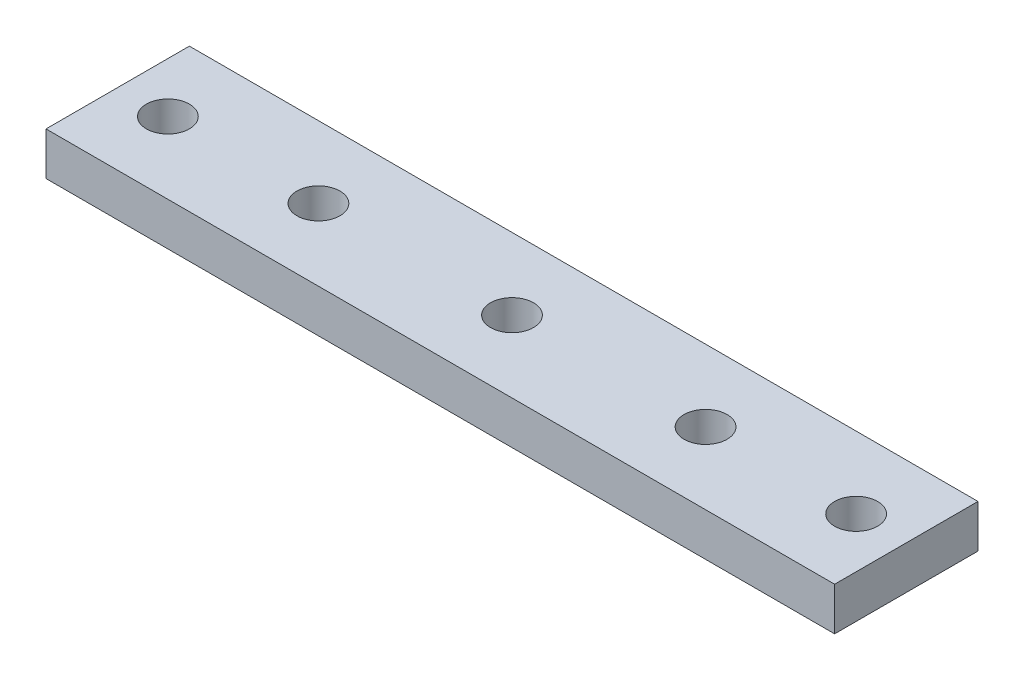
ISO-10303-21;
HEADER;
FILE_DESCRIPTION(('STEP AP214'),'2;1');
FILE_NAME('part.step','',(''),(''),'','','');
FILE_SCHEMA(('AUTOMOTIVE_DESIGN { 1 0 10303 214 1 1 1 1 }'));
ENDSEC;
DATA;
#1=APPLICATION_CONTEXT('core data for automotive mechanical design processes');
#2=APPLICATION_PROTOCOL_DEFINITION('international standard','automotive_design',2000,#1);
#3=PRODUCT_CONTEXT('',#1,'mechanical');
#4=PRODUCT('Part','Part','',(#3));
#5=PRODUCT_RELATED_PRODUCT_CATEGORY('part','',(#4));
#6=PRODUCT_DEFINITION_FORMATION('','',#4);
#7=PRODUCT_DEFINITION_CONTEXT('part definition',#1,'design');
#8=PRODUCT_DEFINITION('design','',#6,#7);
#9=PRODUCT_DEFINITION_SHAPE('','',#8);
#10=(LENGTH_UNIT() NAMED_UNIT(*) SI_UNIT(.MILLI.,.METRE.));
#11=(NAMED_UNIT(*) PLANE_ANGLE_UNIT() SI_UNIT($,.RADIAN.));
#12=(NAMED_UNIT(*) SI_UNIT($,.STERADIAN.) SOLID_ANGLE_UNIT());
#13=UNCERTAINTY_MEASURE_WITH_UNIT(LENGTH_MEASURE(1.E-05),#10,'distance_accuracy_value','');
#14=(GEOMETRIC_REPRESENTATION_CONTEXT(3) GLOBAL_UNCERTAINTY_ASSIGNED_CONTEXT((#13)) GLOBAL_UNIT_ASSIGNED_CONTEXT((#10,
#11,#12)) REPRESENTATION_CONTEXT('',''));
#15=CARTESIAN_POINT('',(0.,0.,0.));
#16=DIRECTION('',(0.,0.,1.));
#17=DIRECTION('',(1.,0.,0.));
#18=AXIS2_PLACEMENT_3D('',#15,#16,#17);
#19=CARTESIAN_POINT('',(0.,6.,0.));
#20=DIRECTION('',(0.,-1.,0.));
#21=DIRECTION('',(0.,0.,-1.));
#22=AXIS2_PLACEMENT_3D('',#19,#20,#21);
#23=PLANE('',#22);
#24=DIRECTION('',(1.,0.,0.));
#25=VECTOR('',#24,1.);
#26=CARTESIAN_POINT('',(110.,6.,0.));
#27=LINE('',#26,#25);
#28=CARTESIAN_POINT('',(0.,6.,0.));
#29=VERTEX_POINT('',#28);
#30=CARTESIAN_POINT('',(110.,6.,0.));
#31=VERTEX_POINT('',#30);
#32=EDGE_CURVE('E85',#29,#31,#27,.T.);
#33=ORIENTED_EDGE('',*,*,#32,.T.);
#34=DIRECTION('',(0.,0.,-1.));
#35=VECTOR('',#34,1.);
#36=CARTESIAN_POINT('',(110.,6.,-20.));
#37=LINE('',#36,#35);
#38=CARTESIAN_POINT('',(110.,6.,-20.));
#39=VERTEX_POINT('',#38);
#40=EDGE_CURVE('E80',#31,#39,#37,.T.);
#41=ORIENTED_EDGE('',*,*,#40,.T.);
#42=DIRECTION('',(-1.,0.,0.));
#43=VECTOR('',#42,1.);
#44=CARTESIAN_POINT('',(0.,6.,-20.));
#45=LINE('',#44,#43);
#46=CARTESIAN_POINT('',(0.,6.,-20.));
#47=VERTEX_POINT('',#46);
#48=EDGE_CURVE('E83',#39,#47,#45,.T.);
#49=ORIENTED_EDGE('',*,*,#48,.T.);
#50=DIRECTION('',(0.,0.,1.));
#51=VECTOR('',#50,1.);
#52=CARTESIAN_POINT('',(0.,6.,0.));
#53=LINE('',#52,#51);
#54=EDGE_CURVE('E50',#47,#29,#53,.T.);
#55=ORIENTED_EDGE('',*,*,#54,.T.);
#56=EDGE_LOOP('',(#33,#41,#49,#55));
#57=FACE_BOUND('',#56,.T.);
#58=CARTESIAN_POINT('',(28.,6.,-10.));
#59=DIRECTION('',(0.,1.,0.));
#60=DIRECTION('',(0.,0.,1.));
#61=AXIS2_PLACEMENT_3D('',#58,#59,#60);
#62=CIRCLE('',#61,2.99999999999999);
#63=CARTESIAN_POINT('',(28.,6.,-7.00000000000001));
#64=VERTEX_POINT('',#63);
#65=EDGE_CURVE('E100',#64,#64,#62,.T.);
#66=ORIENTED_EDGE('',*,*,#65,.F.);
#67=EDGE_LOOP('',(#66));
#68=FACE_BOUND('',#67,.T.);
#69=CARTESIAN_POINT('',(82.,6.,-10.));
#70=DIRECTION('',(0.,1.,0.));
#71=DIRECTION('',(0.,0.,1.));
#72=AXIS2_PLACEMENT_3D('',#69,#70,#71);
#73=CIRCLE('',#72,3.00000000000001);
#74=CARTESIAN_POINT('',(82.,6.,-7.));
#75=VERTEX_POINT('',#74);
#76=EDGE_CURVE('E115',#75,#75,#73,.T.);
#77=ORIENTED_EDGE('',*,*,#76,.F.);
#78=EDGE_LOOP('',(#77));
#79=FACE_BOUND('',#78,.T.);
#80=CARTESIAN_POINT('',(103.,6.,-10.));
#81=DIRECTION('',(0.,1.,0.));
#82=DIRECTION('',(0.,0.,1.));
#83=AXIS2_PLACEMENT_3D('',#80,#81,#82);
#84=CIRCLE('',#83,3.00000000000001);
#85=CARTESIAN_POINT('',(103.,6.,-6.99999999999999));
#86=VERTEX_POINT('',#85);
#87=EDGE_CURVE('E121',#86,#86,#84,.T.);
#88=ORIENTED_EDGE('',*,*,#87,.F.);
#89=EDGE_LOOP('',(#88));
#90=FACE_BOUND('',#89,.T.);
#91=CARTESIAN_POINT('',(7.,6.,-10.));
#92=DIRECTION('',(0.,1.,0.));
#93=DIRECTION('',(0.,0.,1.));
#94=AXIS2_PLACEMENT_3D('',#91,#92,#93);
#95=CIRCLE('',#94,3.);
#96=CARTESIAN_POINT('',(7.,6.,-7.));
#97=VERTEX_POINT('',#96);
#98=EDGE_CURVE('E127',#97,#97,#95,.T.);
#99=ORIENTED_EDGE('',*,*,#98,.F.);
#100=EDGE_LOOP('',(#99));
#101=FACE_BOUND('',#100,.T.);
#102=CARTESIAN_POINT('',(55.,6.,-10.));
#103=DIRECTION('',(0.,1.,0.));
#104=DIRECTION('',(0.,0.,1.));
#105=AXIS2_PLACEMENT_3D('',#102,#103,#104);
#106=CIRCLE('',#105,3.00000000000001);
#107=CARTESIAN_POINT('',(55.,6.,-6.99999999999999));
#108=VERTEX_POINT('',#107);
#109=EDGE_CURVE('E133',#108,#108,#106,.T.);
#110=ORIENTED_EDGE('',*,*,#109,.F.);
#111=EDGE_LOOP('',(#110));
#112=FACE_BOUND('',#111,.T.);
#113=ADVANCED_FACE('F33',(#57,#68,#79,#90,#101,#112),#23,.F.);
#114=CARTESIAN_POINT('',(0.,0.,0.));
#115=DIRECTION('',(0.,-1.,0.));
#116=DIRECTION('',(0.,0.,-1.));
#117=AXIS2_PLACEMENT_3D('',#114,#115,#116);
#118=PLANE('',#117);
#119=CARTESIAN_POINT('',(7.,0.,-10.));
#120=DIRECTION('',(0.,1.,0.));
#121=DIRECTION('',(0.,0.,1.));
#122=AXIS2_PLACEMENT_3D('',#119,#120,#121);
#123=CIRCLE('',#122,3.);
#124=CARTESIAN_POINT('',(7.,0.,-7.));
#125=VERTEX_POINT('',#124);
#126=EDGE_CURVE('E130',#125,#125,#123,.T.);
#127=ORIENTED_EDGE('',*,*,#126,.T.);
#128=EDGE_LOOP('',(#127));
#129=FACE_BOUND('',#128,.T.);
#130=CARTESIAN_POINT('',(82.,0.,-10.));
#131=DIRECTION('',(0.,1.,0.));
#132=DIRECTION('',(0.,0.,1.));
#133=AXIS2_PLACEMENT_3D('',#130,#131,#132);
#134=CIRCLE('',#133,3.00000000000001);
#135=CARTESIAN_POINT('',(82.,0.,-7.));
#136=VERTEX_POINT('',#135);
#137=EDGE_CURVE('E118',#136,#136,#134,.T.);
#138=ORIENTED_EDGE('',*,*,#137,.T.);
#139=EDGE_LOOP('',(#138));
#140=FACE_BOUND('',#139,.T.);
#141=DIRECTION('',(1.,0.,0.));
#142=VECTOR('',#141,1.);
#143=CARTESIAN_POINT('',(110.,0.,0.));
#144=LINE('',#143,#142);
#145=CARTESIAN_POINT('',(0.,0.,0.));
#146=VERTEX_POINT('',#145);
#147=CARTESIAN_POINT('',(110.,0.,0.));
#148=VERTEX_POINT('',#147);
#149=EDGE_CURVE('E97',#146,#148,#144,.T.);
#150=ORIENTED_EDGE('',*,*,#149,.F.);
#151=DIRECTION('',(0.,0.,1.));
#152=VECTOR('',#151,1.);
#153=CARTESIAN_POINT('',(0.,0.,0.));
#154=LINE('',#153,#152);
#155=CARTESIAN_POINT('',(0.,0.,-20.));
#156=VERTEX_POINT('',#155);
#157=EDGE_CURVE('E73',#156,#146,#154,.T.);
#158=ORIENTED_EDGE('',*,*,#157,.F.);
#159=DIRECTION('',(-1.,0.,0.));
#160=VECTOR('',#159,1.);
#161=CARTESIAN_POINT('',(0.,0.,-20.));
#162=LINE('',#161,#160);
#163=CARTESIAN_POINT('',(110.,0.,-20.));
#164=VERTEX_POINT('',#163);
#165=EDGE_CURVE('E67',#164,#156,#162,.T.);
#166=ORIENTED_EDGE('',*,*,#165,.F.);
#167=DIRECTION('',(0.,0.,-1.));
#168=VECTOR('',#167,1.);
#169=CARTESIAN_POINT('',(110.,0.,-20.));
#170=LINE('',#169,#168);
#171=EDGE_CURVE('E89',#148,#164,#170,.T.);
#172=ORIENTED_EDGE('',*,*,#171,.F.);
#173=EDGE_LOOP('',(#150,#158,#166,#172));
#174=FACE_BOUND('',#173,.T.);
#175=CARTESIAN_POINT('',(28.,0.,-10.));
#176=DIRECTION('',(0.,1.,0.));
#177=DIRECTION('',(0.,0.,1.));
#178=AXIS2_PLACEMENT_3D('',#175,#176,#177);
#179=CIRCLE('',#178,2.99999999999999);
#180=CARTESIAN_POINT('',(28.,0.,-7.00000000000001));
#181=VERTEX_POINT('',#180);
#182=EDGE_CURVE('E112',#181,#181,#179,.T.);
#183=ORIENTED_EDGE('',*,*,#182,.T.);
#184=EDGE_LOOP('',(#183));
#185=FACE_BOUND('',#184,.T.);
#186=CARTESIAN_POINT('',(103.,0.,-10.));
#187=DIRECTION('',(0.,1.,0.));
#188=DIRECTION('',(0.,0.,1.));
#189=AXIS2_PLACEMENT_3D('',#186,#187,#188);
#190=CIRCLE('',#189,3.00000000000001);
#191=CARTESIAN_POINT('',(103.,0.,-6.99999999999999));
#192=VERTEX_POINT('',#191);
#193=EDGE_CURVE('E124',#192,#192,#190,.T.);
#194=ORIENTED_EDGE('',*,*,#193,.T.);
#195=EDGE_LOOP('',(#194));
#196=FACE_BOUND('',#195,.T.);
#197=CARTESIAN_POINT('',(55.,0.,-10.));
#198=DIRECTION('',(0.,1.,0.));
#199=DIRECTION('',(0.,0.,1.));
#200=AXIS2_PLACEMENT_3D('',#197,#198,#199);
#201=CIRCLE('',#200,3.00000000000001);
#202=CARTESIAN_POINT('',(55.,0.,-6.99999999999999));
#203=VERTEX_POINT('',#202);
#204=EDGE_CURVE('E136',#203,#203,#201,.T.);
#205=ORIENTED_EDGE('',*,*,#204,.T.);
#206=EDGE_LOOP('',(#205));
#207=FACE_BOUND('',#206,.T.);
#208=ADVANCED_FACE('F108',(#129,#140,#174,#185,#196,#207),#118,.T.);
#209=CARTESIAN_POINT('',(110.,6.,0.));
#210=DIRECTION('',(0.,0.,-1.));
#211=DIRECTION('',(-1.,0.,0.));
#212=AXIS2_PLACEMENT_3D('',#209,#210,#211);
#213=PLANE('',#212);
#214=ORIENTED_EDGE('',*,*,#149,.T.);
#215=DIRECTION('',(0.,-1.,0.));
#216=VECTOR('',#215,1.);
#217=CARTESIAN_POINT('',(110.,6.,0.));
#218=LINE('',#217,#216);
#219=EDGE_CURVE('E11',#31,#148,#218,.T.);
#220=ORIENTED_EDGE('',*,*,#219,.F.);
#221=ORIENTED_EDGE('',*,*,#32,.F.);
#222=DIRECTION('',(0.,-1.,0.));
#223=VECTOR('',#222,1.);
#224=CARTESIAN_POINT('',(0.,6.,0.));
#225=LINE('',#224,#223);
#226=EDGE_CURVE('E93',#29,#146,#225,.T.);
#227=ORIENTED_EDGE('',*,*,#226,.T.);
#228=EDGE_LOOP('',(#214,#220,#221,#227));
#229=FACE_BOUND('',#228,.T.);
#230=ADVANCED_FACE('F35',(#229),#213,.F.);
#231=CARTESIAN_POINT('',(110.,6.,-20.));
#232=DIRECTION('',(-1.,0.,0.));
#233=DIRECTION('',(0.,0.,1.));
#234=AXIS2_PLACEMENT_3D('',#231,#232,#233);
#235=PLANE('',#234);
#236=ORIENTED_EDGE('',*,*,#171,.T.);
#237=DIRECTION('',(0.,-1.,0.));
#238=VECTOR('',#237,1.);
#239=CARTESIAN_POINT('',(110.,6.,-20.));
#240=LINE('',#239,#238);
#241=EDGE_CURVE('E42',#39,#164,#240,.T.);
#242=ORIENTED_EDGE('',*,*,#241,.F.);
#243=ORIENTED_EDGE('',*,*,#40,.F.);
#244=ORIENTED_EDGE('',*,*,#219,.T.);
#245=EDGE_LOOP('',(#236,#242,#243,#244));
#246=FACE_BOUND('',#245,.T.);
#247=ADVANCED_FACE('F88',(#246),#235,.F.);
#248=CARTESIAN_POINT('',(0.,6.,-20.));
#249=DIRECTION('',(0.,0.,1.));
#250=DIRECTION('',(1.,0.,0.));
#251=AXIS2_PLACEMENT_3D('',#248,#249,#250);
#252=PLANE('',#251);
#253=ORIENTED_EDGE('',*,*,#165,.T.);
#254=DIRECTION('',(0.,-1.,0.));
#255=VECTOR('',#254,1.);
#256=CARTESIAN_POINT('',(0.,6.,-20.));
#257=LINE('',#256,#255);
#258=EDGE_CURVE('E90',#47,#156,#257,.T.);
#259=ORIENTED_EDGE('',*,*,#258,.F.);
#260=ORIENTED_EDGE('',*,*,#48,.F.);
#261=ORIENTED_EDGE('',*,*,#241,.T.);
#262=EDGE_LOOP('',(#253,#259,#260,#261));
#263=FACE_BOUND('',#262,.T.);
#264=ADVANCED_FACE('F91',(#263),#252,.F.);
#265=CARTESIAN_POINT('',(0.,6.,0.));
#266=DIRECTION('',(1.,0.,0.));
#267=DIRECTION('',(0.,0.,-1.));
#268=AXIS2_PLACEMENT_3D('',#265,#266,#267);
#269=PLANE('',#268);
#270=ORIENTED_EDGE('',*,*,#157,.T.);
#271=ORIENTED_EDGE('',*,*,#226,.F.);
#272=ORIENTED_EDGE('',*,*,#54,.F.);
#273=ORIENTED_EDGE('',*,*,#258,.T.);
#274=EDGE_LOOP('',(#270,#271,#272,#273));
#275=FACE_BOUND('',#274,.T.);
#276=ADVANCED_FACE('F105',(#275),#269,.F.);
#277=CARTESIAN_POINT('',(28.,6.,-10.));
#278=DIRECTION('',(0.,-1.,0.));
#279=DIRECTION('',(0.,0.,-1.));
#280=AXIS2_PLACEMENT_3D('',#277,#278,#279);
#281=CYLINDRICAL_SURFACE('',#280,2.99999999999999);
#282=ORIENTED_EDGE('',*,*,#65,.T.);
#283=EDGE_LOOP('',(#282));
#284=FACE_BOUND('',#283,.T.);
#285=ORIENTED_EDGE('',*,*,#182,.F.);
#286=EDGE_LOOP('',(#285));
#287=FACE_BOUND('',#286,.T.);
#288=ADVANCED_FACE('F153',(#284,#287),#281,.F.);
#289=CARTESIAN_POINT('',(82.,6.,-10.));
#290=DIRECTION('',(0.,-1.,0.));
#291=DIRECTION('',(0.,0.,-1.));
#292=AXIS2_PLACEMENT_3D('',#289,#290,#291);
#293=CYLINDRICAL_SURFACE('',#292,3.00000000000001);
#294=ORIENTED_EDGE('',*,*,#76,.T.);
#295=EDGE_LOOP('',(#294));
#296=FACE_BOUND('',#295,.T.);
#297=ORIENTED_EDGE('',*,*,#137,.F.);
#298=EDGE_LOOP('',(#297));
#299=FACE_BOUND('',#298,.T.);
#300=ADVANCED_FACE('F199',(#296,#299),#293,.F.);
#301=CARTESIAN_POINT('',(103.,6.,-10.));
#302=DIRECTION('',(0.,-1.,0.));
#303=DIRECTION('',(0.,0.,-1.));
#304=AXIS2_PLACEMENT_3D('',#301,#302,#303);
#305=CYLINDRICAL_SURFACE('',#304,3.00000000000001);
#306=ORIENTED_EDGE('',*,*,#87,.T.);
#307=EDGE_LOOP('',(#306));
#308=FACE_BOUND('',#307,.T.);
#309=ORIENTED_EDGE('',*,*,#193,.F.);
#310=EDGE_LOOP('',(#309));
#311=FACE_BOUND('',#310,.T.);
#312=ADVANCED_FACE('F207',(#308,#311),#305,.F.);
#313=CARTESIAN_POINT('',(7.,6.,-10.));
#314=DIRECTION('',(0.,-1.,0.));
#315=DIRECTION('',(0.,0.,-1.));
#316=AXIS2_PLACEMENT_3D('',#313,#314,#315);
#317=CYLINDRICAL_SURFACE('',#316,3.);
#318=ORIENTED_EDGE('',*,*,#98,.T.);
#319=EDGE_LOOP('',(#318));
#320=FACE_BOUND('',#319,.T.);
#321=ORIENTED_EDGE('',*,*,#126,.F.);
#322=EDGE_LOOP('',(#321));
#323=FACE_BOUND('',#322,.T.);
#324=ADVANCED_FACE('F215',(#320,#323),#317,.F.);
#325=CARTESIAN_POINT('',(55.,6.,-10.));
#326=DIRECTION('',(0.,-1.,0.));
#327=DIRECTION('',(0.,0.,-1.));
#328=AXIS2_PLACEMENT_3D('',#325,#326,#327);
#329=CYLINDRICAL_SURFACE('',#328,3.00000000000001);
#330=ORIENTED_EDGE('',*,*,#109,.T.);
#331=EDGE_LOOP('',(#330));
#332=FACE_BOUND('',#331,.T.);
#333=ORIENTED_EDGE('',*,*,#204,.F.);
#334=EDGE_LOOP('',(#333));
#335=FACE_BOUND('',#334,.T.);
#336=ADVANCED_FACE('F142',(#332,#335),#329,.F.);
#337=CLOSED_SHELL('',(#113,#208,#230,#247,#264,#276,#288,#300,#312,#324,#336));
#338=MANIFOLD_SOLID_BREP('B2',#337);
#339=ADVANCED_BREP_SHAPE_REPRESENTATION('',(#18,#338),#14);
#340=SHAPE_DEFINITION_REPRESENTATION(#9,#339);
ENDSEC;
END-ISO-10303-21;
